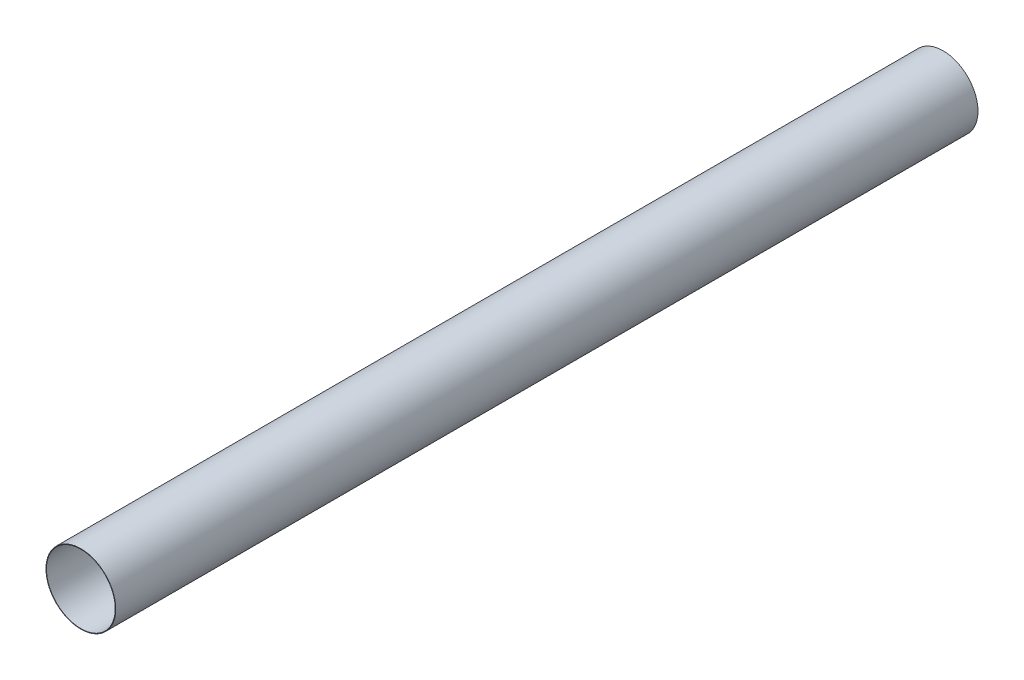
ISO-10303-21;
HEADER;
FILE_DESCRIPTION(('STEP AP214'),'2;1');
FILE_NAME('part.step','',(''),(''),'','','');
FILE_SCHEMA(('AUTOMOTIVE_DESIGN { 1 0 10303 214 1 1 1 1 }'));
ENDSEC;
DATA;
#1=APPLICATION_CONTEXT('core data for automotive mechanical design processes');
#2=APPLICATION_PROTOCOL_DEFINITION('international standard','automotive_design',2000,#1);
#3=PRODUCT_CONTEXT('',#1,'mechanical');
#4=PRODUCT('Part','Part','',(#3));
#5=PRODUCT_RELATED_PRODUCT_CATEGORY('part','',(#4));
#6=PRODUCT_DEFINITION_FORMATION('','',#4);
#7=PRODUCT_DEFINITION_CONTEXT('part definition',#1,'design');
#8=PRODUCT_DEFINITION('design','',#6,#7);
#9=PRODUCT_DEFINITION_SHAPE('','',#8);
#10=(LENGTH_UNIT() NAMED_UNIT(*) SI_UNIT(.MILLI.,.METRE.));
#11=(NAMED_UNIT(*) PLANE_ANGLE_UNIT() SI_UNIT($,.RADIAN.));
#12=(NAMED_UNIT(*) SI_UNIT($,.STERADIAN.) SOLID_ANGLE_UNIT());
#13=UNCERTAINTY_MEASURE_WITH_UNIT(LENGTH_MEASURE(1.E-05),#10,'distance_accuracy_value','');
#14=(GEOMETRIC_REPRESENTATION_CONTEXT(3) GLOBAL_UNCERTAINTY_ASSIGNED_CONTEXT((#13)) GLOBAL_UNIT_ASSIGNED_CONTEXT((#10,
#11,#12)) REPRESENTATION_CONTEXT('',''));
#15=CARTESIAN_POINT('',(0.,0.,0.));
#16=DIRECTION('',(0.,0.,1.));
#17=DIRECTION('',(1.,0.,0.));
#18=AXIS2_PLACEMENT_3D('',#15,#16,#17);
#19=CARTESIAN_POINT('',(0.,0.,1804.));
#20=DIRECTION('',(0.,0.,1.));
#21=DIRECTION('',(1.,0.,0.));
#22=AXIS2_PLACEMENT_3D('',#19,#20,#21);
#23=PLANE('',#22);
#24=CARTESIAN_POINT('',(0.,0.,1804.));
#25=DIRECTION('',(0.,0.,1.));
#26=DIRECTION('',(1.,0.,0.));
#27=AXIS2_PLACEMENT_3D('',#24,#25,#26);
#28=CIRCLE('',#27,73.);
#29=CARTESIAN_POINT('',(73.,0.,1804.));
#30=VERTEX_POINT('',#29);
#31=EDGE_CURVE('E10',#30,#30,#28,.T.);
#32=ORIENTED_EDGE('',*,*,#31,.T.);
#33=EDGE_LOOP('',(#32));
#34=FACE_BOUND('',#33,.T.);
#35=CARTESIAN_POINT('',(0.,0.,1804.));
#36=DIRECTION('',(0.,0.,1.));
#37=DIRECTION('',(1.,0.,0.));
#38=AXIS2_PLACEMENT_3D('',#35,#36,#37);
#39=CIRCLE('',#38,72.);
#40=CARTESIAN_POINT('',(72.,0.,1804.));
#41=VERTEX_POINT('',#40);
#42=EDGE_CURVE('E45',#41,#41,#39,.T.);
#43=ORIENTED_EDGE('',*,*,#42,.F.);
#44=EDGE_LOOP('',(#43));
#45=FACE_BOUND('',#44,.T.);
#46=ADVANCED_FACE('F34',(#34,#45),#23,.T.);
#47=CARTESIAN_POINT('',(0.,0.,0.));
#48=DIRECTION('',(0.,0.,1.));
#49=DIRECTION('',(1.,0.,0.));
#50=AXIS2_PLACEMENT_3D('',#47,#48,#49);
#51=PLANE('',#50);
#52=CARTESIAN_POINT('',(0.,0.,0.));
#53=DIRECTION('',(0.,0.,1.));
#54=DIRECTION('',(1.,0.,0.));
#55=AXIS2_PLACEMENT_3D('',#52,#53,#54);
#56=CIRCLE('',#55,73.);
#57=CARTESIAN_POINT('',(73.,0.,0.));
#58=VERTEX_POINT('',#57);
#59=EDGE_CURVE('E38',#58,#58,#56,.T.);
#60=ORIENTED_EDGE('',*,*,#59,.F.);
#61=EDGE_LOOP('',(#60));
#62=FACE_BOUND('',#61,.T.);
#63=CARTESIAN_POINT('',(0.,0.,0.));
#64=DIRECTION('',(0.,0.,1.));
#65=DIRECTION('',(1.,0.,0.));
#66=AXIS2_PLACEMENT_3D('',#63,#64,#65);
#67=CIRCLE('',#66,72.);
#68=CARTESIAN_POINT('',(72.,0.,0.));
#69=VERTEX_POINT('',#68);
#70=EDGE_CURVE('E47',#69,#69,#67,.T.);
#71=ORIENTED_EDGE('',*,*,#70,.T.);
#72=EDGE_LOOP('',(#71));
#73=FACE_BOUND('',#72,.T.);
#74=ADVANCED_FACE('F57',(#62,#73),#51,.F.);
#75=CARTESIAN_POINT('',(0.,0.,1804.));
#76=DIRECTION('',(0.,0.,-1.));
#77=DIRECTION('',(-1.,0.,0.));
#78=AXIS2_PLACEMENT_3D('',#75,#76,#77);
#79=CYLINDRICAL_SURFACE('',#78,73.);
#80=ORIENTED_EDGE('',*,*,#31,.F.);
#81=EDGE_LOOP('',(#80));
#82=FACE_BOUND('',#81,.T.);
#83=ORIENTED_EDGE('',*,*,#59,.T.);
#84=EDGE_LOOP('',(#83));
#85=FACE_BOUND('',#84,.T.);
#86=ADVANCED_FACE('F36',(#82,#85),#79,.T.);
#87=CARTESIAN_POINT('',(0.,0.,1804.));
#88=DIRECTION('',(0.,0.,-1.));
#89=DIRECTION('',(-1.,0.,0.));
#90=AXIS2_PLACEMENT_3D('',#87,#88,#89);
#91=CYLINDRICAL_SURFACE('',#90,72.);
#92=ORIENTED_EDGE('',*,*,#42,.T.);
#93=EDGE_LOOP('',(#92));
#94=FACE_BOUND('',#93,.T.);
#95=ORIENTED_EDGE('',*,*,#70,.F.);
#96=EDGE_LOOP('',(#95));
#97=FACE_BOUND('',#96,.T.);
#98=ADVANCED_FACE('F53',(#94,#97),#91,.F.);
#99=CLOSED_SHELL('',(#46,#74,#86,#98));
#100=MANIFOLD_SOLID_BREP('B2',#99);
#101=ADVANCED_BREP_SHAPE_REPRESENTATION('',(#18,#100),#14);
#102=SHAPE_DEFINITION_REPRESENTATION(#9,#101);
ENDSEC;
END-ISO-10303-21;
